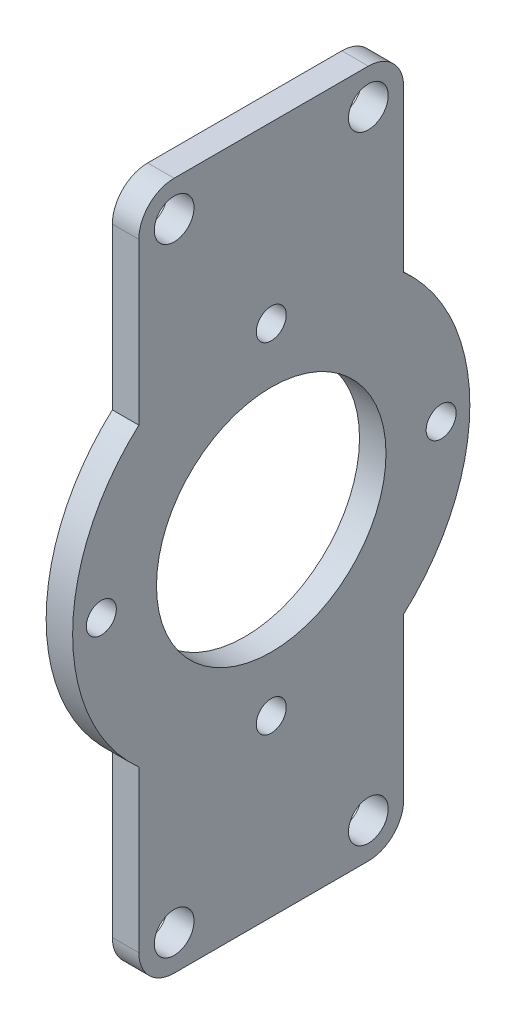
ISO-10303-21;
HEADER;
FILE_DESCRIPTION(('STEP AP214'),'2;1');
FILE_NAME('part.step','',(''),(''),'','','');
FILE_SCHEMA(('AUTOMOTIVE_DESIGN { 1 0 10303 214 1 1 1 1 }'));
ENDSEC;
DATA;
#1=APPLICATION_CONTEXT('core data for automotive mechanical design processes');
#2=APPLICATION_PROTOCOL_DEFINITION('international standard','automotive_design',2000,#1);
#3=PRODUCT_CONTEXT('',#1,'mechanical');
#4=PRODUCT('Part','Part','',(#3));
#5=PRODUCT_RELATED_PRODUCT_CATEGORY('part','',(#4));
#6=PRODUCT_DEFINITION_FORMATION('','',#4);
#7=PRODUCT_DEFINITION_CONTEXT('part definition',#1,'design');
#8=PRODUCT_DEFINITION('design','',#6,#7);
#9=PRODUCT_DEFINITION_SHAPE('','',#8);
#10=(LENGTH_UNIT() NAMED_UNIT(*) SI_UNIT(.MILLI.,.METRE.));
#11=(NAMED_UNIT(*) PLANE_ANGLE_UNIT() SI_UNIT($,.RADIAN.));
#12=(NAMED_UNIT(*) SI_UNIT($,.STERADIAN.) SOLID_ANGLE_UNIT());
#13=UNCERTAINTY_MEASURE_WITH_UNIT(LENGTH_MEASURE(1.E-05),#10,'distance_accuracy_value','');
#14=(GEOMETRIC_REPRESENTATION_CONTEXT(3) GLOBAL_UNCERTAINTY_ASSIGNED_CONTEXT((#13)) GLOBAL_UNIT_ASSIGNED_CONTEXT((#10,
#11,#12)) REPRESENTATION_CONTEXT('',''));
#15=CARTESIAN_POINT('',(0.,0.,0.));
#16=DIRECTION('',(0.,0.,1.));
#17=DIRECTION('',(1.,0.,0.));
#18=AXIS2_PLACEMENT_3D('',#15,#16,#17);
#19=CARTESIAN_POINT('',(0.,78.,30.));
#20=DIRECTION('',(0.,0.,-1.));
#21=DIRECTION('',(-1.,0.,0.));
#22=AXIS2_PLACEMENT_3D('',#19,#20,#21);
#23=PLANE('',#22);
#24=DIRECTION('',(0.,-1.,0.));
#25=VECTOR('',#24,1.);
#26=CARTESIAN_POINT('',(0.,78.,30.));
#27=LINE('',#26,#25);
#28=CARTESIAN_POINT('',(0.,22.2294901687516,30.));
#29=VERTEX_POINT('',#28);
#30=CARTESIAN_POINT('',(0.,4.,30.));
#31=VERTEX_POINT('',#30);
#32=EDGE_CURVE('E180',#29,#31,#27,.T.);
#33=ORIENTED_EDGE('',*,*,#32,.T.);
#34=DIRECTION('',(1.,0.,0.));
#35=VECTOR('',#34,1.);
#36=CARTESIAN_POINT('',(0.,4.,30.));
#37=LINE('',#36,#35);
#38=CARTESIAN_POINT('',(3.,4.,30.));
#39=VERTEX_POINT('',#38);
#40=EDGE_CURVE('E202',#31,#39,#37,.T.);
#41=ORIENTED_EDGE('',*,*,#40,.T.);
#42=DIRECTION('',(0.,-1.,0.));
#43=VECTOR('',#42,1.);
#44=CARTESIAN_POINT('',(3.,78.,30.));
#45=LINE('',#44,#43);
#46=CARTESIAN_POINT('',(3.,22.2294901687516,30.));
#47=VERTEX_POINT('',#46);
#48=EDGE_CURVE('E177',#47,#39,#45,.T.);
#49=ORIENTED_EDGE('',*,*,#48,.F.);
#50=DIRECTION('',(-1.,0.,0.));
#51=VECTOR('',#50,1.);
#52=CARTESIAN_POINT('',(66.6396103067893,22.2294901687516,30.));
#53=LINE('',#52,#51);
#54=EDGE_CURVE('E156',#47,#29,#53,.T.);
#55=ORIENTED_EDGE('',*,*,#54,.T.);
#56=EDGE_LOOP('',(#33,#41,#49,#55));
#57=FACE_BOUND('',#56,.T.);
#58=ADVANCED_FACE('F35',(#57),#23,.F.);
#59=CARTESIAN_POINT('',(0.,78.,0.));
#60=DIRECTION('',(0.,0.,1.));
#61=DIRECTION('',(1.,0.,0.));
#62=AXIS2_PLACEMENT_3D('',#59,#60,#61);
#63=PLANE('',#62);
#64=DIRECTION('',(0.,-1.,0.));
#65=VECTOR('',#64,1.);
#66=CARTESIAN_POINT('',(0.,78.,0.));
#67=LINE('',#66,#65);
#68=CARTESIAN_POINT('',(0.,74.,0.));
#69=VERTEX_POINT('',#68);
#70=CARTESIAN_POINT('',(0.,55.7705098312484,0.));
#71=VERTEX_POINT('',#70);
#72=EDGE_CURVE('E136',#69,#71,#67,.T.);
#73=ORIENTED_EDGE('',*,*,#72,.F.);
#74=DIRECTION('',(-1.,0.,0.));
#75=VECTOR('',#74,1.);
#76=CARTESIAN_POINT('',(3.,74.,0.));
#77=LINE('',#76,#75);
#78=CARTESIAN_POINT('',(3.,74.,0.));
#79=VERTEX_POINT('',#78);
#80=EDGE_CURVE('E11',#69,#79,#77,.F.);
#81=ORIENTED_EDGE('',*,*,#80,.T.);
#82=DIRECTION('',(0.,-1.,0.));
#83=VECTOR('',#82,1.);
#84=CARTESIAN_POINT('',(3.,78.,0.));
#85=LINE('',#84,#83);
#86=CARTESIAN_POINT('',(3.,55.7705098312484,0.));
#87=VERTEX_POINT('',#86);
#88=EDGE_CURVE('E135',#79,#87,#85,.T.);
#89=ORIENTED_EDGE('',*,*,#88,.T.);
#90=DIRECTION('',(-1.,0.,0.));
#91=VECTOR('',#90,1.);
#92=CARTESIAN_POINT('',(66.6396103067893,55.7705098312484,0.));
#93=LINE('',#92,#91);
#94=EDGE_CURVE('E146',#87,#71,#93,.T.);
#95=ORIENTED_EDGE('',*,*,#94,.T.);
#96=EDGE_LOOP('',(#73,#81,#89,#95));
#97=FACE_BOUND('',#96,.T.);
#98=ADVANCED_FACE('F231',(#97),#63,.F.);
#99=CARTESIAN_POINT('',(0.,78.,0.));
#100=DIRECTION('',(1.,0.,0.));
#101=DIRECTION('',(0.,0.,-1.));
#102=AXIS2_PLACEMENT_3D('',#99,#100,#101);
#103=PLANE('',#102);
#104=CARTESIAN_POINT('',(0.,74.,26.));
#105=DIRECTION('',(1.,0.,0.));
#106=DIRECTION('',(0.,0.,-1.));
#107=AXIS2_PLACEMENT_3D('',#104,#105,#106);
#108=CIRCLE('',#107,2.25);
#109=CARTESIAN_POINT('',(0.,74.,23.75));
#110=VERTEX_POINT('',#109);
#111=EDGE_CURVE('E282',#110,#110,#108,.T.);
#112=ORIENTED_EDGE('',*,*,#111,.T.);
#113=EDGE_LOOP('',(#112));
#114=FACE_BOUND('',#113,.T.);
#115=CARTESIAN_POINT('',(0.,74.,4.));
#116=DIRECTION('',(1.,0.,0.));
#117=DIRECTION('',(0.,0.,-1.));
#118=AXIS2_PLACEMENT_3D('',#115,#116,#117);
#119=CIRCLE('',#118,2.25);
#120=CARTESIAN_POINT('',(0.,74.,1.75));
#121=VERTEX_POINT('',#120);
#122=EDGE_CURVE('E276',#121,#121,#119,.T.);
#123=ORIENTED_EDGE('',*,*,#122,.T.);
#124=EDGE_LOOP('',(#123));
#125=FACE_BOUND('',#124,.T.);
#126=CARTESIAN_POINT('',(0.,3.99999999999996,4.));
#127=DIRECTION('',(1.,0.,0.));
#128=DIRECTION('',(0.,0.,-1.));
#129=AXIS2_PLACEMENT_3D('',#126,#127,#128);
#130=CIRCLE('',#129,2.25);
#131=CARTESIAN_POINT('',(0.,3.99999999999996,1.75));
#132=VERTEX_POINT('',#131);
#133=EDGE_CURVE('E270',#132,#132,#130,.T.);
#134=ORIENTED_EDGE('',*,*,#133,.T.);
#135=EDGE_LOOP('',(#134));
#136=FACE_BOUND('',#135,.T.);
#137=CARTESIAN_POINT('',(0.,3.99999999999996,26.));
#138=DIRECTION('',(1.,0.,0.));
#139=DIRECTION('',(0.,0.,-1.));
#140=AXIS2_PLACEMENT_3D('',#137,#138,#139);
#141=CIRCLE('',#140,2.25);
#142=CARTESIAN_POINT('',(0.,3.99999999999996,23.75));
#143=VERTEX_POINT('',#142);
#144=EDGE_CURVE('E264',#143,#143,#141,.T.);
#145=ORIENTED_EDGE('',*,*,#144,.T.);
#146=EDGE_LOOP('',(#145));
#147=FACE_BOUND('',#146,.T.);
#148=CARTESIAN_POINT('',(0.,58.25,15.));
#149=DIRECTION('',(1.,0.,0.));
#150=DIRECTION('',(0.,0.,-1.));
#151=AXIS2_PLACEMENT_3D('',#148,#149,#150);
#152=CIRCLE('',#151,1.7);
#153=CARTESIAN_POINT('',(0.,58.25,13.3));
#154=VERTEX_POINT('',#153);
#155=EDGE_CURVE('E258',#154,#154,#152,.T.);
#156=ORIENTED_EDGE('',*,*,#155,.T.);
#157=EDGE_LOOP('',(#156));
#158=FACE_BOUND('',#157,.T.);
#159=CARTESIAN_POINT('',(0.,39.,-4.25000000000001));
#160=DIRECTION('',(1.,0.,0.));
#161=DIRECTION('',(0.,0.,-1.));
#162=AXIS2_PLACEMENT_3D('',#159,#160,#161);
#163=CIRCLE('',#162,1.7);
#164=CARTESIAN_POINT('',(0.,39.,-5.95000000000001));
#165=VERTEX_POINT('',#164);
#166=EDGE_CURVE('E252',#165,#165,#163,.T.);
#167=ORIENTED_EDGE('',*,*,#166,.T.);
#168=EDGE_LOOP('',(#167));
#169=FACE_BOUND('',#168,.T.);
#170=CARTESIAN_POINT('',(0.,19.75,15.));
#171=DIRECTION('',(1.,0.,0.));
#172=DIRECTION('',(0.,0.,-1.));
#173=AXIS2_PLACEMENT_3D('',#170,#171,#172);
#174=CIRCLE('',#173,1.7);
#175=CARTESIAN_POINT('',(0.,19.75,13.3));
#176=VERTEX_POINT('',#175);
#177=EDGE_CURVE('E246',#176,#176,#174,.T.);
#178=ORIENTED_EDGE('',*,*,#177,.T.);
#179=EDGE_LOOP('',(#178));
#180=FACE_BOUND('',#179,.T.);
#181=CARTESIAN_POINT('',(0.,39.,34.25));
#182=DIRECTION('',(1.,0.,0.));
#183=DIRECTION('',(0.,0.,-1.));
#184=AXIS2_PLACEMENT_3D('',#181,#182,#183);
#185=CIRCLE('',#184,1.7);
#186=CARTESIAN_POINT('',(0.,39.,32.55));
#187=VERTEX_POINT('',#186);
#188=EDGE_CURVE('E239',#187,#187,#185,.T.);
#189=ORIENTED_EDGE('',*,*,#188,.T.);
#190=EDGE_LOOP('',(#189));
#191=FACE_BOUND('',#190,.T.);
#192=CARTESIAN_POINT('',(0.,39.,15.));
#193=DIRECTION('',(-1.,0.,0.));
#194=DIRECTION('',(0.,0.,1.));
#195=AXIS2_PLACEMENT_3D('',#192,#193,#194);
#196=CIRCLE('',#195,13.);
#197=CARTESIAN_POINT('',(0.,39.,28.));
#198=VERTEX_POINT('',#197);
#199=EDGE_CURVE('E234',#198,#198,#196,.T.);
#200=ORIENTED_EDGE('',*,*,#199,.F.);
#201=EDGE_LOOP('',(#200));
#202=FACE_BOUND('',#201,.T.);
#203=CARTESIAN_POINT('',(0.,22.2294901687516,0.));
#204=VERTEX_POINT('',#203);
#205=CARTESIAN_POINT('',(0.,4.,0.));
#206=VERTEX_POINT('',#205);
#207=EDGE_CURVE('E142',#204,#206,#67,.T.);
#208=ORIENTED_EDGE('',*,*,#207,.T.);
#209=CARTESIAN_POINT('',(0.,4.,4.));
#210=DIRECTION('',(1.,0.,0.));
#211=DIRECTION('',(0.,0.,-1.));
#212=AXIS2_PLACEMENT_3D('',#209,#210,#211);
#213=CIRCLE('',#212,4.);
#214=CARTESIAN_POINT('',(0.,0.,4.));
#215=VERTEX_POINT('',#214);
#216=EDGE_CURVE('E191',#206,#215,#213,.F.);
#217=ORIENTED_EDGE('',*,*,#216,.T.);
#218=DIRECTION('',(0.,0.,1.));
#219=VECTOR('',#218,1.);
#220=CARTESIAN_POINT('',(0.,0.,0.));
#221=LINE('',#220,#219);
#222=CARTESIAN_POINT('',(0.,0.,26.));
#223=VERTEX_POINT('',#222);
#224=EDGE_CURVE('E165',#215,#223,#221,.T.);
#225=ORIENTED_EDGE('',*,*,#224,.T.);
#226=CARTESIAN_POINT('',(0.,4.,26.));
#227=DIRECTION('',(1.,0.,0.));
#228=DIRECTION('',(0.,0.,-1.));
#229=AXIS2_PLACEMENT_3D('',#226,#227,#228);
#230=CIRCLE('',#229,4.);
#231=EDGE_CURVE('E189',#223,#31,#230,.F.);
#232=ORIENTED_EDGE('',*,*,#231,.T.);
#233=ORIENTED_EDGE('',*,*,#32,.F.);
#234=CARTESIAN_POINT('',(0.,39.,15.));
#235=DIRECTION('',(-1.,0.,0.));
#236=DIRECTION('',(0.,0.,1.));
#237=AXIS2_PLACEMENT_3D('',#234,#235,#236);
#238=CIRCLE('',#237,22.5);
#239=CARTESIAN_POINT('',(0.,55.7705098312484,30.));
#240=VERTEX_POINT('',#239);
#241=EDGE_CURVE('E160',#29,#240,#238,.T.);
#242=ORIENTED_EDGE('',*,*,#241,.T.);
#243=CARTESIAN_POINT('',(0.,74.,30.));
#244=VERTEX_POINT('',#243);
#245=EDGE_CURVE('E147',#244,#240,#27,.T.);
#246=ORIENTED_EDGE('',*,*,#245,.F.);
#247=CARTESIAN_POINT('',(0.,74.,26.));
#248=DIRECTION('',(1.,0.,0.));
#249=DIRECTION('',(0.,0.,-1.));
#250=AXIS2_PLACEMENT_3D('',#247,#248,#249);
#251=CIRCLE('',#250,4.);
#252=CARTESIAN_POINT('',(0.,78.,26.));
#253=VERTEX_POINT('',#252);
#254=EDGE_CURVE('E187',#244,#253,#251,.F.);
#255=ORIENTED_EDGE('',*,*,#254,.T.);
#256=DIRECTION('',(0.,0.,1.));
#257=VECTOR('',#256,1.);
#258=CARTESIAN_POINT('',(0.,78.,0.));
#259=LINE('',#258,#257);
#260=CARTESIAN_POINT('',(0.,78.,4.));
#261=VERTEX_POINT('',#260);
#262=EDGE_CURVE('E166',#261,#253,#259,.T.);
#263=ORIENTED_EDGE('',*,*,#262,.F.);
#264=CARTESIAN_POINT('',(0.,74.,4.));
#265=DIRECTION('',(1.,0.,0.));
#266=DIRECTION('',(0.,0.,-1.));
#267=AXIS2_PLACEMENT_3D('',#264,#265,#266);
#268=CIRCLE('',#267,4.);
#269=EDGE_CURVE('E185',#261,#69,#268,.F.);
#270=ORIENTED_EDGE('',*,*,#269,.T.);
#271=ORIENTED_EDGE('',*,*,#72,.T.);
#272=EDGE_CURVE('E158',#71,#204,#238,.T.);
#273=ORIENTED_EDGE('',*,*,#272,.T.);
#274=EDGE_LOOP('',(#208,#217,#225,#232,#233,#242,#246,#255,#263,#270,#271,#273));
#275=FACE_BOUND('',#274,.T.);
#276=ADVANCED_FACE('F218',(#114,#125,#136,#147,#158,#169,#180,#191,#202,#275),#103,.F.);
#277=CARTESIAN_POINT('',(3.,74.,30.));
#278=VERTEX_POINT('',#277);
#279=CARTESIAN_POINT('',(3.,55.7705098312484,30.));
#280=VERTEX_POINT('',#279);
#281=EDGE_CURVE('E178',#278,#280,#45,.T.);
#282=ORIENTED_EDGE('',*,*,#281,.F.);
#283=DIRECTION('',(1.,0.,0.));
#284=VECTOR('',#283,1.);
#285=CARTESIAN_POINT('',(0.,74.,30.));
#286=LINE('',#285,#284);
#287=EDGE_CURVE('E43',#278,#244,#286,.F.);
#288=ORIENTED_EDGE('',*,*,#287,.T.);
#289=ORIENTED_EDGE('',*,*,#245,.T.);
#290=DIRECTION('',(-1.,0.,0.));
#291=VECTOR('',#290,1.);
#292=CARTESIAN_POINT('',(66.6396103067893,55.7705098312484,30.));
#293=LINE('',#292,#291);
#294=EDGE_CURVE('E152',#240,#280,#293,.F.);
#295=ORIENTED_EDGE('',*,*,#294,.T.);
#296=EDGE_LOOP('',(#282,#288,#289,#295));
#297=FACE_BOUND('',#296,.T.);
#298=ADVANCED_FACE('F212',(#297),#23,.F.);
#299=CARTESIAN_POINT('',(3.,78.,0.));
#300=DIRECTION('',(-1.,0.,0.));
#301=DIRECTION('',(0.,0.,1.));
#302=AXIS2_PLACEMENT_3D('',#299,#300,#301);
#303=PLANE('',#302);
#304=CARTESIAN_POINT('',(3.,74.,26.));
#305=DIRECTION('',(1.,0.,0.));
#306=DIRECTION('',(0.,0.,-1.));
#307=AXIS2_PLACEMENT_3D('',#304,#305,#306);
#308=CIRCLE('',#307,2.25);
#309=CARTESIAN_POINT('',(3.,74.,23.75));
#310=VERTEX_POINT('',#309);
#311=EDGE_CURVE('E285',#310,#310,#308,.T.);
#312=ORIENTED_EDGE('',*,*,#311,.F.);
#313=EDGE_LOOP('',(#312));
#314=FACE_BOUND('',#313,.T.);
#315=CARTESIAN_POINT('',(3.,74.,4.));
#316=DIRECTION('',(1.,0.,0.));
#317=DIRECTION('',(0.,0.,-1.));
#318=AXIS2_PLACEMENT_3D('',#315,#316,#317);
#319=CIRCLE('',#318,2.25);
#320=CARTESIAN_POINT('',(3.,74.,1.75));
#321=VERTEX_POINT('',#320);
#322=EDGE_CURVE('E279',#321,#321,#319,.T.);
#323=ORIENTED_EDGE('',*,*,#322,.F.);
#324=EDGE_LOOP('',(#323));
#325=FACE_BOUND('',#324,.T.);
#326=CARTESIAN_POINT('',(3.,3.99999999999996,4.));
#327=DIRECTION('',(1.,0.,0.));
#328=DIRECTION('',(0.,0.,-1.));
#329=AXIS2_PLACEMENT_3D('',#326,#327,#328);
#330=CIRCLE('',#329,2.25);
#331=CARTESIAN_POINT('',(3.,3.99999999999996,1.75));
#332=VERTEX_POINT('',#331);
#333=EDGE_CURVE('E273',#332,#332,#330,.T.);
#334=ORIENTED_EDGE('',*,*,#333,.F.);
#335=EDGE_LOOP('',(#334));
#336=FACE_BOUND('',#335,.T.);
#337=CARTESIAN_POINT('',(3.,3.99999999999996,26.));
#338=DIRECTION('',(1.,0.,0.));
#339=DIRECTION('',(0.,0.,-1.));
#340=AXIS2_PLACEMENT_3D('',#337,#338,#339);
#341=CIRCLE('',#340,2.25);
#342=CARTESIAN_POINT('',(3.,3.99999999999996,23.75));
#343=VERTEX_POINT('',#342);
#344=EDGE_CURVE('E267',#343,#343,#341,.T.);
#345=ORIENTED_EDGE('',*,*,#344,.F.);
#346=EDGE_LOOP('',(#345));
#347=FACE_BOUND('',#346,.T.);
#348=CARTESIAN_POINT('',(3.,58.25,15.));
#349=DIRECTION('',(1.,0.,0.));
#350=DIRECTION('',(0.,0.,-1.));
#351=AXIS2_PLACEMENT_3D('',#348,#349,#350);
#352=CIRCLE('',#351,1.7);
#353=CARTESIAN_POINT('',(3.,58.25,13.3));
#354=VERTEX_POINT('',#353);
#355=EDGE_CURVE('E261',#354,#354,#352,.T.);
#356=ORIENTED_EDGE('',*,*,#355,.F.);
#357=EDGE_LOOP('',(#356));
#358=FACE_BOUND('',#357,.T.);
#359=CARTESIAN_POINT('',(3.,39.,-4.25000000000001));
#360=DIRECTION('',(1.,0.,0.));
#361=DIRECTION('',(0.,0.,-1.));
#362=AXIS2_PLACEMENT_3D('',#359,#360,#361);
#363=CIRCLE('',#362,1.7);
#364=CARTESIAN_POINT('',(3.,39.,-5.95000000000001));
#365=VERTEX_POINT('',#364);
#366=EDGE_CURVE('E255',#365,#365,#363,.T.);
#367=ORIENTED_EDGE('',*,*,#366,.F.);
#368=EDGE_LOOP('',(#367));
#369=FACE_BOUND('',#368,.T.);
#370=CARTESIAN_POINT('',(3.,19.75,15.));
#371=DIRECTION('',(1.,0.,0.));
#372=DIRECTION('',(0.,0.,-1.));
#373=AXIS2_PLACEMENT_3D('',#370,#371,#372);
#374=CIRCLE('',#373,1.7);
#375=CARTESIAN_POINT('',(3.,19.75,13.3));
#376=VERTEX_POINT('',#375);
#377=EDGE_CURVE('E249',#376,#376,#374,.T.);
#378=ORIENTED_EDGE('',*,*,#377,.F.);
#379=EDGE_LOOP('',(#378));
#380=FACE_BOUND('',#379,.T.);
#381=CARTESIAN_POINT('',(3.,39.,34.25));
#382=DIRECTION('',(1.,0.,0.));
#383=DIRECTION('',(0.,0.,-1.));
#384=AXIS2_PLACEMENT_3D('',#381,#382,#383);
#385=CIRCLE('',#384,1.7);
#386=CARTESIAN_POINT('',(3.,39.,32.55));
#387=VERTEX_POINT('',#386);
#388=EDGE_CURVE('E243',#387,#387,#385,.T.);
#389=ORIENTED_EDGE('',*,*,#388,.F.);
#390=EDGE_LOOP('',(#389));
#391=FACE_BOUND('',#390,.T.);
#392=CARTESIAN_POINT('',(3.00000000000001,39.,15.));
#393=DIRECTION('',(-1.,0.,0.));
#394=DIRECTION('',(0.,0.,1.));
#395=AXIS2_PLACEMENT_3D('',#392,#393,#394);
#396=CIRCLE('',#395,13.);
#397=CARTESIAN_POINT('',(3.00000000000001,39.,28.));
#398=VERTEX_POINT('',#397);
#399=EDGE_CURVE('E232',#398,#398,#396,.T.);
#400=ORIENTED_EDGE('',*,*,#399,.T.);
#401=EDGE_LOOP('',(#400));
#402=FACE_BOUND('',#401,.T.);
#403=DIRECTION('',(0.,0.,-1.));
#404=VECTOR('',#403,1.);
#405=CARTESIAN_POINT('',(3.,0.,0.));
#406=LINE('',#405,#404);
#407=CARTESIAN_POINT('',(3.,0.,26.));
#408=VERTEX_POINT('',#407);
#409=CARTESIAN_POINT('',(3.,0.,4.));
#410=VERTEX_POINT('',#409);
#411=EDGE_CURVE('E170',#408,#410,#406,.T.);
#412=ORIENTED_EDGE('',*,*,#411,.T.);
#413=CARTESIAN_POINT('',(3.,4.,4.));
#414=DIRECTION('',(-1.,0.,0.));
#415=DIRECTION('',(0.,0.,1.));
#416=AXIS2_PLACEMENT_3D('',#413,#414,#415);
#417=CIRCLE('',#416,4.);
#418=CARTESIAN_POINT('',(3.,4.,0.));
#419=VERTEX_POINT('',#418);
#420=EDGE_CURVE('E131',#410,#419,#417,.F.);
#421=ORIENTED_EDGE('',*,*,#420,.T.);
#422=CARTESIAN_POINT('',(3.,22.2294901687516,0.));
#423=VERTEX_POINT('',#422);
#424=EDGE_CURVE('E123',#423,#419,#85,.T.);
#425=ORIENTED_EDGE('',*,*,#424,.F.);
#426=CARTESIAN_POINT('',(3.,39.,15.));
#427=DIRECTION('',(-1.,0.,0.));
#428=DIRECTION('',(0.,0.,1.));
#429=AXIS2_PLACEMENT_3D('',#426,#427,#428);
#430=CIRCLE('',#429,22.5);
#431=EDGE_CURVE('E129',#423,#87,#430,.F.);
#432=ORIENTED_EDGE('',*,*,#431,.T.);
#433=ORIENTED_EDGE('',*,*,#88,.F.);
#434=CARTESIAN_POINT('',(3.,74.,4.));
#435=DIRECTION('',(-1.,0.,0.));
#436=DIRECTION('',(0.,0.,1.));
#437=AXIS2_PLACEMENT_3D('',#434,#435,#436);
#438=CIRCLE('',#437,4.);
#439=CARTESIAN_POINT('',(3.,78.,4.));
#440=VERTEX_POINT('',#439);
#441=EDGE_CURVE('E197',#79,#440,#438,.F.);
#442=ORIENTED_EDGE('',*,*,#441,.T.);
#443=DIRECTION('',(0.,0.,-1.));
#444=VECTOR('',#443,1.);
#445=CARTESIAN_POINT('',(3.,78.,0.));
#446=LINE('',#445,#444);
#447=CARTESIAN_POINT('',(3.,78.,26.));
#448=VERTEX_POINT('',#447);
#449=EDGE_CURVE('E169',#448,#440,#446,.T.);
#450=ORIENTED_EDGE('',*,*,#449,.F.);
#451=CARTESIAN_POINT('',(3.,74.,26.));
#452=DIRECTION('',(-1.,0.,0.));
#453=DIRECTION('',(0.,0.,1.));
#454=AXIS2_PLACEMENT_3D('',#451,#452,#453);
#455=CIRCLE('',#454,4.);
#456=EDGE_CURVE('E58',#448,#278,#455,.F.);
#457=ORIENTED_EDGE('',*,*,#456,.T.);
#458=ORIENTED_EDGE('',*,*,#281,.T.);
#459=EDGE_CURVE('E153',#280,#47,#430,.F.);
#460=ORIENTED_EDGE('',*,*,#459,.T.);
#461=ORIENTED_EDGE('',*,*,#48,.T.);
#462=CARTESIAN_POINT('',(3.,4.,26.));
#463=DIRECTION('',(-1.,0.,0.));
#464=DIRECTION('',(0.,0.,1.));
#465=AXIS2_PLACEMENT_3D('',#462,#463,#464);
#466=CIRCLE('',#465,4.);
#467=EDGE_CURVE('E50',#39,#408,#466,.F.);
#468=ORIENTED_EDGE('',*,*,#467,.T.);
#469=EDGE_LOOP('',(#412,#421,#425,#432,#433,#442,#450,#457,#458,#460,#461,#468));
#470=FACE_BOUND('',#469,.T.);
#471=ADVANCED_FACE('F126',(#314,#325,#336,#347,#358,#369,#380,#391,#402,#470),#303,.F.);
#472=ORIENTED_EDGE('',*,*,#424,.T.);
#473=DIRECTION('',(-1.,0.,0.));
#474=VECTOR('',#473,1.);
#475=CARTESIAN_POINT('',(0.,4.,0.));
#476=LINE('',#475,#474);
#477=EDGE_CURVE('E183',#419,#206,#476,.T.);
#478=ORIENTED_EDGE('',*,*,#477,.T.);
#479=ORIENTED_EDGE('',*,*,#207,.F.);
#480=DIRECTION('',(-1.,0.,0.));
#481=VECTOR('',#480,1.);
#482=CARTESIAN_POINT('',(66.6396103067893,22.2294901687516,0.));
#483=LINE('',#482,#481);
#484=EDGE_CURVE('E139',#204,#423,#483,.F.);
#485=ORIENTED_EDGE('',*,*,#484,.T.);
#486=EDGE_LOOP('',(#472,#478,#479,#485));
#487=FACE_BOUND('',#486,.T.);
#488=ADVANCED_FACE('F140',(#487),#63,.F.);
#489=CARTESIAN_POINT('',(0.,78.,0.));
#490=DIRECTION('',(0.,1.,0.));
#491=DIRECTION('',(0.,0.,1.));
#492=AXIS2_PLACEMENT_3D('',#489,#490,#491);
#493=PLANE('',#492);
#494=ORIENTED_EDGE('',*,*,#262,.T.);
#495=DIRECTION('',(1.,0.,0.));
#496=VECTOR('',#495,1.);
#497=CARTESIAN_POINT('',(3.,78.,26.));
#498=LINE('',#497,#496);
#499=EDGE_CURVE('E207',#253,#448,#498,.T.);
#500=ORIENTED_EDGE('',*,*,#499,.T.);
#501=ORIENTED_EDGE('',*,*,#449,.T.);
#502=DIRECTION('',(-1.,0.,0.));
#503=VECTOR('',#502,1.);
#504=CARTESIAN_POINT('',(0.,78.,4.));
#505=LINE('',#504,#503);
#506=EDGE_CURVE('E204',#440,#261,#505,.T.);
#507=ORIENTED_EDGE('',*,*,#506,.T.);
#508=EDGE_LOOP('',(#494,#500,#501,#507));
#509=FACE_BOUND('',#508,.T.);
#510=ADVANCED_FACE('F224',(#509),#493,.T.);
#511=CARTESIAN_POINT('',(0.,0.,0.));
#512=DIRECTION('',(0.,1.,0.));
#513=DIRECTION('',(0.,0.,1.));
#514=AXIS2_PLACEMENT_3D('',#511,#512,#513);
#515=PLANE('',#514);
#516=ORIENTED_EDGE('',*,*,#224,.F.);
#517=DIRECTION('',(-1.,0.,0.));
#518=VECTOR('',#517,1.);
#519=CARTESIAN_POINT('',(0.,0.,4.));
#520=LINE('',#519,#518);
#521=EDGE_CURVE('E195',#215,#410,#520,.F.);
#522=ORIENTED_EDGE('',*,*,#521,.T.);
#523=ORIENTED_EDGE('',*,*,#411,.F.);
#524=DIRECTION('',(1.,0.,0.));
#525=VECTOR('',#524,1.);
#526=CARTESIAN_POINT('',(0.,0.,26.));
#527=LINE('',#526,#525);
#528=EDGE_CURVE('E193',#408,#223,#527,.F.);
#529=ORIENTED_EDGE('',*,*,#528,.T.);
#530=EDGE_LOOP('',(#516,#522,#523,#529));
#531=FACE_BOUND('',#530,.T.);
#532=ADVANCED_FACE('F379',(#531),#515,.F.);
#533=CARTESIAN_POINT('',(66.6396103067893,39.,15.));
#534=DIRECTION('',(-1.,0.,0.));
#535=DIRECTION('',(0.,0.,1.));
#536=AXIS2_PLACEMENT_3D('',#533,#534,#535);
#537=CYLINDRICAL_SURFACE('',#536,22.5);
#538=ORIENTED_EDGE('',*,*,#94,.F.);
#539=ORIENTED_EDGE('',*,*,#431,.F.);
#540=ORIENTED_EDGE('',*,*,#484,.F.);
#541=ORIENTED_EDGE('',*,*,#272,.F.);
#542=EDGE_LOOP('',(#538,#539,#540,#541));
#543=FACE_BOUND('',#542,.T.);
#544=ADVANCED_FACE('F150',(#543),#537,.T.);
#545=ORIENTED_EDGE('',*,*,#54,.F.);
#546=ORIENTED_EDGE('',*,*,#459,.F.);
#547=ORIENTED_EDGE('',*,*,#294,.F.);
#548=ORIENTED_EDGE('',*,*,#241,.F.);
#549=EDGE_LOOP('',(#545,#546,#547,#548));
#550=FACE_BOUND('',#549,.T.);
#551=ADVANCED_FACE('F321',(#550),#537,.T.);
#552=CARTESIAN_POINT('',(3.00000000000001,39.,15.));
#553=DIRECTION('',(-1.,0.,0.));
#554=DIRECTION('',(0.,0.,1.));
#555=AXIS2_PLACEMENT_3D('',#552,#553,#554);
#556=CYLINDRICAL_SURFACE('',#555,13.);
#557=ORIENTED_EDGE('',*,*,#399,.F.);
#558=EDGE_LOOP('',(#557));
#559=FACE_BOUND('',#558,.T.);
#560=ORIENTED_EDGE('',*,*,#199,.T.);
#561=EDGE_LOOP('',(#560));
#562=FACE_BOUND('',#561,.T.);
#563=ADVANCED_FACE('F311',(#559,#562),#556,.F.);
#564=CARTESIAN_POINT('',(3.,39.,34.25));
#565=DIRECTION('',(1.,0.,0.));
#566=DIRECTION('',(0.,0.,-1.));
#567=AXIS2_PLACEMENT_3D('',#564,#565,#566);
#568=CYLINDRICAL_SURFACE('',#567,1.7);
#569=ORIENTED_EDGE('',*,*,#188,.F.);
#570=EDGE_LOOP('',(#569));
#571=FACE_BOUND('',#570,.T.);
#572=ORIENTED_EDGE('',*,*,#388,.T.);
#573=EDGE_LOOP('',(#572));
#574=FACE_BOUND('',#573,.T.);
#575=ADVANCED_FACE('F308',(#571,#574),#568,.F.);
#576=CARTESIAN_POINT('',(3.,19.75,15.));
#577=DIRECTION('',(1.,0.,0.));
#578=DIRECTION('',(0.,0.,-1.));
#579=AXIS2_PLACEMENT_3D('',#576,#577,#578);
#580=CYLINDRICAL_SURFACE('',#579,1.7);
#581=ORIENTED_EDGE('',*,*,#177,.F.);
#582=EDGE_LOOP('',(#581));
#583=FACE_BOUND('',#582,.T.);
#584=ORIENTED_EDGE('',*,*,#377,.T.);
#585=EDGE_LOOP('',(#584));
#586=FACE_BOUND('',#585,.T.);
#587=ADVANCED_FACE('F310',(#583,#586),#580,.F.);
#588=CARTESIAN_POINT('',(3.,39.,-4.25000000000001));
#589=DIRECTION('',(1.,0.,0.));
#590=DIRECTION('',(0.,0.,-1.));
#591=AXIS2_PLACEMENT_3D('',#588,#589,#590);
#592=CYLINDRICAL_SURFACE('',#591,1.7);
#593=ORIENTED_EDGE('',*,*,#166,.F.);
#594=EDGE_LOOP('',(#593));
#595=FACE_BOUND('',#594,.T.);
#596=ORIENTED_EDGE('',*,*,#366,.T.);
#597=EDGE_LOOP('',(#596));
#598=FACE_BOUND('',#597,.T.);
#599=ADVANCED_FACE('F318',(#595,#598),#592,.F.);
#600=CARTESIAN_POINT('',(3.,58.25,15.));
#601=DIRECTION('',(1.,0.,0.));
#602=DIRECTION('',(0.,0.,-1.));
#603=AXIS2_PLACEMENT_3D('',#600,#601,#602);
#604=CYLINDRICAL_SURFACE('',#603,1.7);
#605=ORIENTED_EDGE('',*,*,#155,.F.);
#606=EDGE_LOOP('',(#605));
#607=FACE_BOUND('',#606,.T.);
#608=ORIENTED_EDGE('',*,*,#355,.T.);
#609=EDGE_LOOP('',(#608));
#610=FACE_BOUND('',#609,.T.);
#611=ADVANCED_FACE('F467',(#607,#610),#604,.F.);
#612=CARTESIAN_POINT('',(3.,3.99999999999996,26.));
#613=DIRECTION('',(1.,0.,0.));
#614=DIRECTION('',(0.,0.,-1.));
#615=AXIS2_PLACEMENT_3D('',#612,#613,#614);
#616=CYLINDRICAL_SURFACE('',#615,2.25);
#617=ORIENTED_EDGE('',*,*,#144,.F.);
#618=EDGE_LOOP('',(#617));
#619=FACE_BOUND('',#618,.T.);
#620=ORIENTED_EDGE('',*,*,#344,.T.);
#621=EDGE_LOOP('',(#620));
#622=FACE_BOUND('',#621,.T.);
#623=ADVANCED_FACE('F476',(#619,#622),#616,.F.);
#624=CARTESIAN_POINT('',(3.,3.99999999999996,4.));
#625=DIRECTION('',(1.,0.,0.));
#626=DIRECTION('',(0.,0.,-1.));
#627=AXIS2_PLACEMENT_3D('',#624,#625,#626);
#628=CYLINDRICAL_SURFACE('',#627,2.25);
#629=ORIENTED_EDGE('',*,*,#133,.F.);
#630=EDGE_LOOP('',(#629));
#631=FACE_BOUND('',#630,.T.);
#632=ORIENTED_EDGE('',*,*,#333,.T.);
#633=EDGE_LOOP('',(#632));
#634=FACE_BOUND('',#633,.T.);
#635=ADVANCED_FACE('F485',(#631,#634),#628,.F.);
#636=CARTESIAN_POINT('',(3.,74.,4.));
#637=DIRECTION('',(1.,0.,0.));
#638=DIRECTION('',(0.,0.,-1.));
#639=AXIS2_PLACEMENT_3D('',#636,#637,#638);
#640=CYLINDRICAL_SURFACE('',#639,2.25);
#641=ORIENTED_EDGE('',*,*,#122,.F.);
#642=EDGE_LOOP('',(#641));
#643=FACE_BOUND('',#642,.T.);
#644=ORIENTED_EDGE('',*,*,#322,.T.);
#645=EDGE_LOOP('',(#644));
#646=FACE_BOUND('',#645,.T.);
#647=ADVANCED_FACE('F494',(#643,#646),#640,.F.);
#648=CARTESIAN_POINT('',(3.,74.,26.));
#649=DIRECTION('',(1.,0.,0.));
#650=DIRECTION('',(0.,0.,-1.));
#651=AXIS2_PLACEMENT_3D('',#648,#649,#650);
#652=CYLINDRICAL_SURFACE('',#651,2.25);
#653=ORIENTED_EDGE('',*,*,#111,.F.);
#654=EDGE_LOOP('',(#653));
#655=FACE_BOUND('',#654,.T.);
#656=ORIENTED_EDGE('',*,*,#311,.T.);
#657=EDGE_LOOP('',(#656));
#658=FACE_BOUND('',#657,.T.);
#659=ADVANCED_FACE('F289',(#655,#658),#652,.F.);
#660=CARTESIAN_POINT('',(0.,4.,4.));
#661=DIRECTION('',(-1.,0.,0.));
#662=DIRECTION('',(0.,0.,1.));
#663=AXIS2_PLACEMENT_3D('',#660,#661,#662);
#664=CYLINDRICAL_SURFACE('',#663,4.);
#665=ORIENTED_EDGE('',*,*,#420,.F.);
#666=ORIENTED_EDGE('',*,*,#521,.F.);
#667=ORIENTED_EDGE('',*,*,#216,.F.);
#668=ORIENTED_EDGE('',*,*,#477,.F.);
#669=EDGE_LOOP('',(#665,#666,#667,#668));
#670=FACE_BOUND('',#669,.T.);
#671=ADVANCED_FACE('F344',(#670),#664,.T.);
#672=CARTESIAN_POINT('',(0.,4.,26.));
#673=DIRECTION('',(1.,0.,0.));
#674=DIRECTION('',(0.,0.,-1.));
#675=AXIS2_PLACEMENT_3D('',#672,#673,#674);
#676=CYLINDRICAL_SURFACE('',#675,4.);
#677=ORIENTED_EDGE('',*,*,#231,.F.);
#678=ORIENTED_EDGE('',*,*,#528,.F.);
#679=ORIENTED_EDGE('',*,*,#467,.F.);
#680=ORIENTED_EDGE('',*,*,#40,.F.);
#681=EDGE_LOOP('',(#677,#678,#679,#680));
#682=FACE_BOUND('',#681,.T.);
#683=ADVANCED_FACE('F347',(#682),#676,.T.);
#684=CARTESIAN_POINT('',(0.,74.,26.));
#685=DIRECTION('',(-1.,0.,0.));
#686=DIRECTION('',(0.,0.,1.));
#687=AXIS2_PLACEMENT_3D('',#684,#685,#686);
#688=CYLINDRICAL_SURFACE('',#687,4.);
#689=ORIENTED_EDGE('',*,*,#254,.F.);
#690=ORIENTED_EDGE('',*,*,#287,.F.);
#691=ORIENTED_EDGE('',*,*,#456,.F.);
#692=ORIENTED_EDGE('',*,*,#499,.F.);
#693=EDGE_LOOP('',(#689,#690,#691,#692));
#694=FACE_BOUND('',#693,.T.);
#695=ADVANCED_FACE('F222',(#694),#688,.T.);
#696=CARTESIAN_POINT('',(0.,74.,4.));
#697=DIRECTION('',(1.,0.,0.));
#698=DIRECTION('',(0.,0.,-1.));
#699=AXIS2_PLACEMENT_3D('',#696,#697,#698);
#700=CYLINDRICAL_SURFACE('',#699,4.);
#701=ORIENTED_EDGE('',*,*,#441,.F.);
#702=ORIENTED_EDGE('',*,*,#80,.F.);
#703=ORIENTED_EDGE('',*,*,#269,.F.);
#704=ORIENTED_EDGE('',*,*,#506,.F.);
#705=EDGE_LOOP('',(#701,#702,#703,#704));
#706=FACE_BOUND('',#705,.T.);
#707=ADVANCED_FACE('F37',(#706),#700,.T.);
#708=CLOSED_SHELL('',(#58,#98,#276,#298,#471,#488,#510,#532,#544,#551,#563,#575,#587,#599,#611,
#623,#635,#647,#659,#671,#683,#695,#707));
#709=MANIFOLD_SOLID_BREP('B2',#708);
#710=ADVANCED_BREP_SHAPE_REPRESENTATION('',(#18,#709),#14);
#711=SHAPE_DEFINITION_REPRESENTATION(#9,#710);
ENDSEC;
END-ISO-10303-21;
